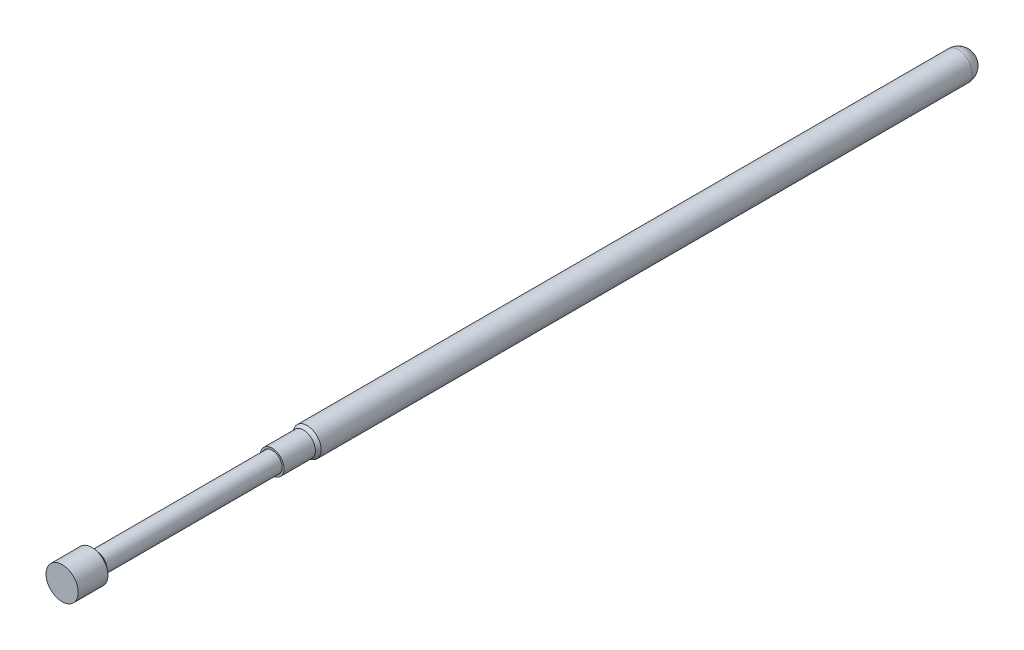
ISO-10303-21;
HEADER;
FILE_DESCRIPTION(('STEP AP214'),'2;1');
FILE_NAME('part.step','',(''),(''),'','','');
FILE_SCHEMA(('AUTOMOTIVE_DESIGN { 1 0 10303 214 1 1 1 1 }'));
ENDSEC;
DATA;
#1=APPLICATION_CONTEXT('core data for automotive mechanical design processes');
#2=APPLICATION_PROTOCOL_DEFINITION('international standard','automotive_design',2000,#1);
#3=PRODUCT_CONTEXT('',#1,'mechanical');
#4=PRODUCT('Part','Part','',(#3));
#5=PRODUCT_RELATED_PRODUCT_CATEGORY('part','',(#4));
#6=PRODUCT_DEFINITION_FORMATION('','',#4);
#7=PRODUCT_DEFINITION_CONTEXT('part definition',#1,'design');
#8=PRODUCT_DEFINITION('design','',#6,#7);
#9=PRODUCT_DEFINITION_SHAPE('','',#8);
#10=(LENGTH_UNIT() NAMED_UNIT(*) SI_UNIT(.MILLI.,.METRE.));
#11=(NAMED_UNIT(*) PLANE_ANGLE_UNIT() SI_UNIT($,.RADIAN.));
#12=(NAMED_UNIT(*) SI_UNIT($,.STERADIAN.) SOLID_ANGLE_UNIT());
#13=UNCERTAINTY_MEASURE_WITH_UNIT(LENGTH_MEASURE(1.E-05),#10,'distance_accuracy_value','');
#14=(GEOMETRIC_REPRESENTATION_CONTEXT(3) GLOBAL_UNCERTAINTY_ASSIGNED_CONTEXT((#13)) GLOBAL_UNIT_ASSIGNED_CONTEXT((#10,
#11,#12)) REPRESENTATION_CONTEXT('',''));
#15=CARTESIAN_POINT('',(0.,0.,0.));
#16=DIRECTION('',(0.,0.,1.));
#17=DIRECTION('',(1.,0.,0.));
#18=AXIS2_PLACEMENT_3D('',#15,#16,#17);
#19=CARTESIAN_POINT('',(0.,0.,16.51));
#20=DIRECTION('',(0.,0.,-1.));
#21=DIRECTION('',(0.,1.,0.));
#22=AXIS2_PLACEMENT_3D('',#19,#20,#21);
#23=PLANE('',#22);
#24=CARTESIAN_POINT('',(0.,0.,16.51));
#25=DIRECTION('',(0.,0.,-1.));
#26=DIRECTION('',(0.,1.,0.));
#27=AXIS2_PLACEMENT_3D('',#24,#25,#26);
#28=CIRCLE('',#27,0.584199999999985);
#29=CARTESIAN_POINT('',(0.,0.584199999999996,16.51));
#30=VERTEX_POINT('',#29);
#31=EDGE_CURVE('E61',#30,#30,#28,.T.);
#32=ORIENTED_EDGE('',*,*,#31,.F.);
#33=EDGE_LOOP('',(#32));
#34=FACE_BOUND('',#33,.T.);
#35=ADVANCED_FACE('F47',(#34),#23,.F.);
#36=CARTESIAN_POINT('',(0.,0.,2.54));
#37=DIRECTION('',(0.,0.,1.));
#38=DIRECTION('',(0.,-1.,0.));
#39=AXIS2_PLACEMENT_3D('',#36,#37,#38);
#40=PLANE('',#39);
#41=CARTESIAN_POINT('',(0.,0.,2.54));
#42=DIRECTION('',(0.,0.,-1.));
#43=DIRECTION('',(0.,1.,0.));
#44=AXIS2_PLACEMENT_3D('',#41,#42,#43);
#45=CIRCLE('',#44,0.355599999999993);
#46=CARTESIAN_POINT('',(0.,0.355599999999995,2.54));
#47=VERTEX_POINT('',#46);
#48=EDGE_CURVE('E11',#47,#47,#45,.T.);
#49=ORIENTED_EDGE('',*,*,#48,.T.);
#50=EDGE_LOOP('',(#49));
#51=FACE_BOUND('',#50,.T.);
#52=ADVANCED_FACE('F70',(#51),#40,.F.);
#53=CARTESIAN_POINT('',(0.,0.,0.));
#54=DIRECTION('',(0.,0.,-1.));
#55=DIRECTION('',(0.,1.,0.));
#56=AXIS2_PLACEMENT_3D('',#53,#54,#55);
#57=CYLINDRICAL_SURFACE('',#56,0.355599999999989);
#58=ORIENTED_EDGE('',*,*,#48,.F.);
#59=EDGE_LOOP('',(#58));
#60=FACE_BOUND('',#59,.T.);
#61=CARTESIAN_POINT('',(0.,0.,15.24));
#62=DIRECTION('',(0.,0.,-1.));
#63=DIRECTION('',(0.,1.,0.));
#64=AXIS2_PLACEMENT_3D('',#61,#62,#63);
#65=CIRCLE('',#64,0.355599999999986);
#66=CARTESIAN_POINT('',(0.,0.355599999999996,15.24));
#67=VERTEX_POINT('',#66);
#68=EDGE_CURVE('E53',#67,#67,#65,.T.);
#69=ORIENTED_EDGE('',*,*,#68,.T.);
#70=EDGE_LOOP('',(#69));
#71=FACE_BOUND('',#70,.T.);
#72=ADVANCED_FACE('F74',(#60,#71),#57,.T.);
#73=CARTESIAN_POINT('',(0.,0.,15.4305));
#74=DIRECTION('',(0.,0.,1.));
#75=DIRECTION('',(0.,-1.,0.));
#76=AXIS2_PLACEMENT_3D('',#73,#74,#75);
#77=CONICAL_SURFACE('',#76,0.584199999999986,0.876058050598194);
#78=ORIENTED_EDGE('',*,*,#68,.F.);
#79=EDGE_LOOP('',(#78));
#80=FACE_BOUND('',#79,.T.);
#81=CARTESIAN_POINT('',(0.,0.,15.4305));
#82=DIRECTION('',(0.,0.,-1.));
#83=DIRECTION('',(0.,1.,0.));
#84=AXIS2_PLACEMENT_3D('',#81,#82,#83);
#85=CIRCLE('',#84,0.584199999999986);
#86=CARTESIAN_POINT('',(0.,0.584199999999996,15.4305));
#87=VERTEX_POINT('',#86);
#88=EDGE_CURVE('E57',#87,#87,#85,.T.);
#89=ORIENTED_EDGE('',*,*,#88,.T.);
#90=EDGE_LOOP('',(#89));
#91=FACE_BOUND('',#90,.T.);
#92=ADVANCED_FACE('F78',(#80,#91),#77,.T.);
#93=CARTESIAN_POINT('',(0.,0.,0.));
#94=DIRECTION('',(0.,0.,-1.));
#95=DIRECTION('',(0.,1.,0.));
#96=AXIS2_PLACEMENT_3D('',#93,#94,#95);
#97=CYLINDRICAL_SURFACE('',#96,0.584199999999985);
#98=ORIENTED_EDGE('',*,*,#88,.F.);
#99=EDGE_LOOP('',(#98));
#100=FACE_BOUND('',#99,.T.);
#101=ORIENTED_EDGE('',*,*,#31,.T.);
#102=EDGE_LOOP('',(#101));
#103=FACE_BOUND('',#102,.T.);
#104=ADVANCED_FACE('F67',(#100,#103),#97,.T.);
#105=CLOSED_SHELL('',(#35,#52,#72,#92,#104));
#106=MANIFOLD_SOLID_BREP('B2',#105);
#107=CARTESIAN_POINT('',(0.,0.,-16.002));
#108=DIRECTION('',(0.,0.,-1.));
#109=DIRECTION('',(0.,1.,0.));
#110=AXIS2_PLACEMENT_3D('',#107,#108,#109);
#111=SPHERICAL_SURFACE('',#110,0.508000000000001);
#112=CARTESIAN_POINT('',(0.,0.,-16.002));
#113=DIRECTION('',(0.,0.,-1.));
#114=DIRECTION('',(-1.,0.,0.));
#115=AXIS2_PLACEMENT_3D('',#112,#113,#114);
#116=CIRCLE('',#115,0.507999999999994);
#117=CARTESIAN_POINT('',(-0.507999999999994,0.,-16.002));
#118=VERTEX_POINT('',#117);
#119=EDGE_CURVE('E46',#118,#118,#116,.T.);
#120=ORIENTED_EDGE('',*,*,#119,.T.);
#121=EDGE_LOOP('',(#120));
#122=FACE_BOUND('',#121,.T.);
#123=ADVANCED_FACE('F121',(#122),#111,.T.);
#124=CARTESIAN_POINT('',(0.,0.,-16.51));
#125=DIRECTION('',(0.,0.,-1.));
#126=DIRECTION('',(-1.,0.,0.));
#127=AXIS2_PLACEMENT_3D('',#124,#125,#126);
#128=CYLINDRICAL_SURFACE('',#127,0.507999999999994);
#129=CARTESIAN_POINT('',(0.,0.,7.62));
#130=DIRECTION('',(0.,0.,-1.));
#131=DIRECTION('',(-1.,0.,0.));
#132=AXIS2_PLACEMENT_3D('',#129,#130,#131);
#133=CIRCLE('',#132,0.507999999999994);
#134=CARTESIAN_POINT('',(-0.507999999999994,0.,7.62));
#135=VERTEX_POINT('',#134);
#136=EDGE_CURVE('E127',#135,#135,#133,.T.);
#137=ORIENTED_EDGE('',*,*,#136,.T.);
#138=EDGE_LOOP('',(#137));
#139=FACE_BOUND('',#138,.T.);
#140=ORIENTED_EDGE('',*,*,#119,.F.);
#141=EDGE_LOOP('',(#140));
#142=FACE_BOUND('',#141,.T.);
#143=ADVANCED_FACE('F170',(#139,#142),#128,.T.);
#144=CARTESIAN_POINT('',(0.,0.,7.62));
#145=DIRECTION('',(0.,0.,-1.));
#146=DIRECTION('',(-1.,0.,0.));
#147=AXIS2_PLACEMENT_3D('',#144,#145,#146);
#148=CONICAL_SURFACE('',#147,0.507999999999994,0.52359877559829);
#149=CARTESIAN_POINT('',(0.,0.,7.75198227153675));
#150=DIRECTION('',(0.,0.,-1.));
#151=DIRECTION('',(-1.,0.,0.));
#152=AXIS2_PLACEMENT_3D('',#149,#150,#151);
#153=CIRCLE('',#152,0.431799999999994);
#154=CARTESIAN_POINT('',(-0.431799999999994,0.,7.75198227153675));
#155=VERTEX_POINT('',#154);
#156=EDGE_CURVE('E131',#155,#155,#153,.T.);
#157=ORIENTED_EDGE('',*,*,#156,.T.);
#158=EDGE_LOOP('',(#157));
#159=FACE_BOUND('',#158,.T.);
#160=ORIENTED_EDGE('',*,*,#136,.F.);
#161=EDGE_LOOP('',(#160));
#162=FACE_BOUND('',#161,.T.);
#163=ADVANCED_FACE('F164',(#159,#162),#148,.T.);
#164=CARTESIAN_POINT('',(0.,0.,-16.51));
#165=DIRECTION('',(0.,0.,-1.));
#166=DIRECTION('',(-1.,0.,0.));
#167=AXIS2_PLACEMENT_3D('',#164,#165,#166);
#168=CYLINDRICAL_SURFACE('',#167,0.431799999999994);
#169=CARTESIAN_POINT('',(0.,0.,8.89));
#170=DIRECTION('',(0.,0.,-1.));
#171=DIRECTION('',(-1.,0.,0.));
#172=AXIS2_PLACEMENT_3D('',#169,#170,#171);
#173=CIRCLE('',#172,0.431799999999994);
#174=CARTESIAN_POINT('',(-0.431799999999994,0.,8.89));
#175=VERTEX_POINT('',#174);
#176=EDGE_CURVE('E135',#175,#175,#173,.T.);
#177=ORIENTED_EDGE('',*,*,#176,.T.);
#178=EDGE_LOOP('',(#177));
#179=FACE_BOUND('',#178,.T.);
#180=ORIENTED_EDGE('',*,*,#156,.F.);
#181=EDGE_LOOP('',(#180));
#182=FACE_BOUND('',#181,.T.);
#183=ADVANCED_FACE('F158',(#179,#182),#168,.T.);
#184=CARTESIAN_POINT('',(0.,0.,8.89));
#185=DIRECTION('',(0.,0.,1.));
#186=DIRECTION('',(1.,0.,0.));
#187=AXIS2_PLACEMENT_3D('',#184,#185,#186);
#188=PLANE('',#187);
#189=CARTESIAN_POINT('',(0.,0.,8.89));
#190=DIRECTION('',(0.,0.,1.));
#191=DIRECTION('',(1.,0.,0.));
#192=AXIS2_PLACEMENT_3D('',#189,#190,#191);
#193=CIRCLE('',#192,0.36576);
#194=CARTESIAN_POINT('',(0.36576,0.,8.89));
#195=VERTEX_POINT('',#194);
#196=EDGE_CURVE('E141',#195,#195,#193,.T.);
#197=ORIENTED_EDGE('',*,*,#196,.F.);
#198=EDGE_LOOP('',(#197));
#199=FACE_BOUND('',#198,.T.);
#200=ORIENTED_EDGE('',*,*,#176,.F.);
#201=EDGE_LOOP('',(#200));
#202=FACE_BOUND('',#201,.T.);
#203=ADVANCED_FACE('F152',(#199,#202),#188,.T.);
#204=CARTESIAN_POINT('',(0.,0.,-4.445));
#205=DIRECTION('',(0.,0.,1.));
#206=DIRECTION('',(1.,0.,0.));
#207=AXIS2_PLACEMENT_3D('',#204,#205,#206);
#208=CYLINDRICAL_SURFACE('',#207,0.36576);
#209=CARTESIAN_POINT('',(0.,0.,-4.445));
#210=DIRECTION('',(0.,0.,1.));
#211=DIRECTION('',(1.,0.,0.));
#212=AXIS2_PLACEMENT_3D('',#209,#210,#211);
#213=CIRCLE('',#212,0.36576);
#214=CARTESIAN_POINT('',(0.36576,0.,-4.445));
#215=VERTEX_POINT('',#214);
#216=EDGE_CURVE('E140',#215,#215,#213,.T.);
#217=ORIENTED_EDGE('',*,*,#216,.F.);
#218=EDGE_LOOP('',(#217));
#219=FACE_BOUND('',#218,.T.);
#220=ORIENTED_EDGE('',*,*,#196,.T.);
#221=EDGE_LOOP('',(#220));
#222=FACE_BOUND('',#221,.T.);
#223=ADVANCED_FACE('F149',(#219,#222),#208,.F.);
#224=CARTESIAN_POINT('',(0.,0.,-4.445));
#225=DIRECTION('',(0.,0.,1.));
#226=DIRECTION('',(1.,0.,0.));
#227=AXIS2_PLACEMENT_3D('',#224,#225,#226);
#228=PLANE('',#227);
#229=ORIENTED_EDGE('',*,*,#216,.T.);
#230=EDGE_LOOP('',(#229));
#231=FACE_BOUND('',#230,.T.);
#232=ADVANCED_FACE('F147',(#231),#228,.T.);
#233=CLOSED_SHELL('',(#123,#143,#163,#183,#203,#223,#232));
#234=MANIFOLD_SOLID_BREP('B6',#233);
#235=ADVANCED_BREP_SHAPE_REPRESENTATION('',(#18,#106,#234),#14);
#236=SHAPE_DEFINITION_REPRESENTATION(#9,#235);
ENDSEC;
END-ISO-10303-21;
